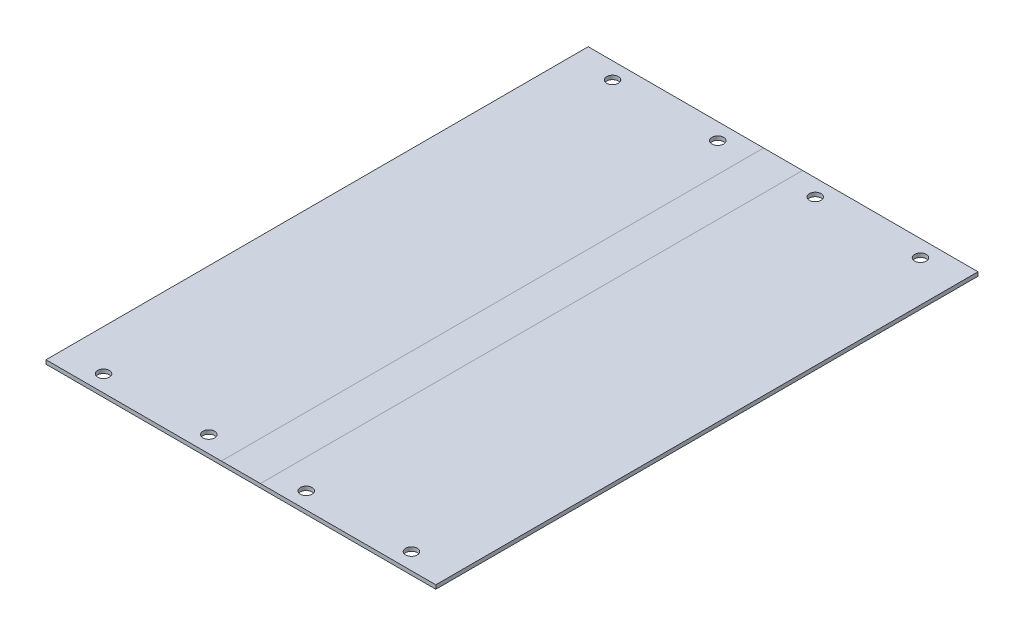
ISO-10303-21;
HEADER;
FILE_DESCRIPTION(('STEP AP214'),'2;1');
FILE_NAME('part.step','',(''),(''),'','','');
FILE_SCHEMA(('AUTOMOTIVE_DESIGN { 1 0 10303 214 1 1 1 1 }'));
ENDSEC;
DATA;
#1=APPLICATION_CONTEXT('core data for automotive mechanical design processes');
#2=APPLICATION_PROTOCOL_DEFINITION('international standard','automotive_design',2000,#1);
#3=PRODUCT_CONTEXT('',#1,'mechanical');
#4=PRODUCT('Part','Part','',(#3));
#5=PRODUCT_RELATED_PRODUCT_CATEGORY('part','',(#4));
#6=PRODUCT_DEFINITION_FORMATION('','',#4);
#7=PRODUCT_DEFINITION_CONTEXT('part definition',#1,'design');
#8=PRODUCT_DEFINITION('design','',#6,#7);
#9=PRODUCT_DEFINITION_SHAPE('','',#8);
#10=(LENGTH_UNIT() NAMED_UNIT(*) SI_UNIT(.MILLI.,.METRE.));
#11=(NAMED_UNIT(*) PLANE_ANGLE_UNIT() SI_UNIT($,.RADIAN.));
#12=(NAMED_UNIT(*) SI_UNIT($,.STERADIAN.) SOLID_ANGLE_UNIT());
#13=UNCERTAINTY_MEASURE_WITH_UNIT(LENGTH_MEASURE(1.E-05),#10,'distance_accuracy_value','');
#14=(GEOMETRIC_REPRESENTATION_CONTEXT(3) GLOBAL_UNCERTAINTY_ASSIGNED_CONTEXT((#13)) GLOBAL_UNIT_ASSIGNED_CONTEXT((#10,
#11,#12)) REPRESENTATION_CONTEXT('',''));
#15=CARTESIAN_POINT('',(0.,0.,0.));
#16=DIRECTION('',(0.,0.,1.));
#17=DIRECTION('',(1.,0.,0.));
#18=AXIS2_PLACEMENT_3D('',#15,#16,#17);
#19=CARTESIAN_POINT('',(0.,1.,0.));
#20=DIRECTION('',(0.,1.,0.));
#21=DIRECTION('',(0.,0.,1.));
#22=AXIS2_PLACEMENT_3D('',#19,#20,#21);
#23=PLANE('',#22);
#24=DIRECTION('',(1.,0.,0.));
#25=VECTOR('',#24,1.);
#26=CARTESIAN_POINT('',(-50.,1.,69.55));
#27=LINE('',#26,#25);
#28=CARTESIAN_POINT('',(-4.99999999999999,1.,69.55));
#29=VERTEX_POINT('',#28);
#30=CARTESIAN_POINT('',(5.00000000000001,1.,69.55));
#31=VERTEX_POINT('',#30);
#32=EDGE_CURVE('E129',#29,#31,#27,.T.);
#33=ORIENTED_EDGE('',*,*,#32,.T.);
#34=DIRECTION('',(0.,0.,-1.));
#35=VECTOR('',#34,1.);
#36=CARTESIAN_POINT('',(5.00000000000001,1.,0.));
#37=LINE('',#36,#35);
#38=CARTESIAN_POINT('',(5.00000000000001,1.,-69.55));
#39=VERTEX_POINT('',#38);
#40=EDGE_CURVE('E11',#31,#39,#37,.T.);
#41=ORIENTED_EDGE('',*,*,#40,.T.);
#42=DIRECTION('',(-1.,0.,0.));
#43=VECTOR('',#42,1.);
#44=CARTESIAN_POINT('',(-50.,1.,-69.55));
#45=LINE('',#44,#43);
#46=CARTESIAN_POINT('',(-4.99999999999999,1.,-69.55));
#47=VERTEX_POINT('',#46);
#48=EDGE_CURVE('E91',#39,#47,#45,.T.);
#49=ORIENTED_EDGE('',*,*,#48,.T.);
#50=DIRECTION('',(0.,0.,-1.));
#51=VECTOR('',#50,1.);
#52=CARTESIAN_POINT('',(-4.99999999999999,1.,0.));
#53=LINE('',#52,#51);
#54=EDGE_CURVE('E43',#29,#47,#53,.T.);
#55=ORIENTED_EDGE('',*,*,#54,.F.);
#56=EDGE_LOOP('',(#33,#41,#49,#55));
#57=FACE_BOUND('',#56,.T.);
#58=ADVANCED_FACE('F34',(#57),#23,.T.);
#59=CARTESIAN_POINT('',(-12.5,1.,-65.29));
#60=DIRECTION('',(0.,1.,0.));
#61=DIRECTION('',(0.,0.,1.));
#62=AXIS2_PLACEMENT_3D('',#59,#60,#61);
#63=CIRCLE('',#62,1.5);
#64=CARTESIAN_POINT('',(-12.5,1.,-63.79));
#65=VERTEX_POINT('',#64);
#66=EDGE_CURVE('E131',#65,#65,#63,.T.);
#67=ORIENTED_EDGE('',*,*,#66,.F.);
#68=EDGE_LOOP('',(#67));
#69=FACE_BOUND('',#68,.T.);
#70=CARTESIAN_POINT('',(-39.5,1.,-65.29));
#71=DIRECTION('',(0.,1.,0.));
#72=DIRECTION('',(0.,0.,1.));
#73=AXIS2_PLACEMENT_3D('',#70,#71,#72);
#74=CIRCLE('',#73,1.5);
#75=CARTESIAN_POINT('',(-39.5,1.,-63.79));
#76=VERTEX_POINT('',#75);
#77=EDGE_CURVE('E137',#76,#76,#74,.T.);
#78=ORIENTED_EDGE('',*,*,#77,.F.);
#79=EDGE_LOOP('',(#78));
#80=FACE_BOUND('',#79,.T.);
#81=CARTESIAN_POINT('',(-12.5,1.,65.29));
#82=DIRECTION('',(0.,1.,0.));
#83=DIRECTION('',(0.,0.,-1.));
#84=AXIS2_PLACEMENT_3D('',#81,#82,#83);
#85=CIRCLE('',#84,1.5);
#86=CARTESIAN_POINT('',(-12.5,1.,63.79));
#87=VERTEX_POINT('',#86);
#88=EDGE_CURVE('E167',#87,#87,#85,.T.);
#89=ORIENTED_EDGE('',*,*,#88,.F.);
#90=EDGE_LOOP('',(#89));
#91=FACE_BOUND('',#90,.T.);
#92=CARTESIAN_POINT('',(-39.5,1.,65.29));
#93=DIRECTION('',(0.,1.,0.));
#94=DIRECTION('',(0.,0.,-1.));
#95=AXIS2_PLACEMENT_3D('',#92,#93,#94);
#96=CIRCLE('',#95,1.5);
#97=CARTESIAN_POINT('',(-39.5,1.,63.79));
#98=VERTEX_POINT('',#97);
#99=EDGE_CURVE('E173',#98,#98,#96,.T.);
#100=ORIENTED_EDGE('',*,*,#99,.F.);
#101=EDGE_LOOP('',(#100));
#102=FACE_BOUND('',#101,.T.);
#103=CARTESIAN_POINT('',(-50.,1.,69.55));
#104=VERTEX_POINT('',#103);
#105=EDGE_CURVE('E119',#104,#29,#27,.T.);
#106=ORIENTED_EDGE('',*,*,#105,.T.);
#107=ORIENTED_EDGE('',*,*,#54,.T.);
#108=CARTESIAN_POINT('',(-50.,1.,-69.55));
#109=VERTEX_POINT('',#108);
#110=EDGE_CURVE('E94',#47,#109,#45,.T.);
#111=ORIENTED_EDGE('',*,*,#110,.T.);
#112=DIRECTION('',(0.,0.,1.));
#113=VECTOR('',#112,1.);
#114=CARTESIAN_POINT('',(-50.,1.,-69.55));
#115=LINE('',#114,#113);
#116=EDGE_CURVE('E92',#109,#104,#115,.T.);
#117=ORIENTED_EDGE('',*,*,#116,.T.);
#118=EDGE_LOOP('',(#106,#107,#111,#117));
#119=FACE_BOUND('',#118,.T.);
#120=ADVANCED_FACE('F189',(#69,#80,#91,#102,#119),#23,.T.);
#121=CARTESIAN_POINT('',(50.,1.,-69.55));
#122=DIRECTION('',(-1.,0.,0.));
#123=DIRECTION('',(0.,0.,1.));
#124=AXIS2_PLACEMENT_3D('',#121,#122,#123);
#125=PLANE('',#124);
#126=DIRECTION('',(0.,0.,-1.));
#127=VECTOR('',#126,1.);
#128=CARTESIAN_POINT('',(50.,0.,-69.55));
#129=LINE('',#128,#127);
#130=CARTESIAN_POINT('',(50.,0.,69.55));
#131=VERTEX_POINT('',#130);
#132=CARTESIAN_POINT('',(50.,0.,-69.55));
#133=VERTEX_POINT('',#132);
#134=EDGE_CURVE('E106',#131,#133,#129,.T.);
#135=ORIENTED_EDGE('',*,*,#134,.T.);
#136=DIRECTION('',(0.,-1.,0.));
#137=VECTOR('',#136,1.);
#138=CARTESIAN_POINT('',(50.,1.,-69.55));
#139=LINE('',#138,#137);
#140=CARTESIAN_POINT('',(50.,1.,-69.55));
#141=VERTEX_POINT('',#140);
#142=EDGE_CURVE('E88',#141,#133,#139,.T.);
#143=ORIENTED_EDGE('',*,*,#142,.F.);
#144=DIRECTION('',(0.,0.,-1.));
#145=VECTOR('',#144,1.);
#146=CARTESIAN_POINT('',(50.,1.,-69.55));
#147=LINE('',#146,#145);
#148=CARTESIAN_POINT('',(50.,1.,69.55));
#149=VERTEX_POINT('',#148);
#150=EDGE_CURVE('E96',#149,#141,#147,.T.);
#151=ORIENTED_EDGE('',*,*,#150,.F.);
#152=DIRECTION('',(0.,-1.,0.));
#153=VECTOR('',#152,1.);
#154=CARTESIAN_POINT('',(50.,1.,69.55));
#155=LINE('',#154,#153);
#156=EDGE_CURVE('E117',#149,#131,#155,.T.);
#157=ORIENTED_EDGE('',*,*,#156,.T.);
#158=EDGE_LOOP('',(#135,#143,#151,#157));
#159=FACE_BOUND('',#158,.T.);
#160=ADVANCED_FACE('F36',(#159),#125,.F.);
#161=CARTESIAN_POINT('',(-50.,1.,-69.55));
#162=DIRECTION('',(0.,0.,1.));
#163=DIRECTION('',(1.,0.,0.));
#164=AXIS2_PLACEMENT_3D('',#161,#162,#163);
#165=PLANE('',#164);
#166=DIRECTION('',(-1.,0.,0.));
#167=VECTOR('',#166,1.);
#168=CARTESIAN_POINT('',(-50.,0.,-69.55));
#169=LINE('',#168,#167);
#170=CARTESIAN_POINT('',(-50.,0.,-69.55));
#171=VERTEX_POINT('',#170);
#172=EDGE_CURVE('E123',#133,#171,#169,.T.);
#173=ORIENTED_EDGE('',*,*,#172,.T.);
#174=DIRECTION('',(0.,-1.,0.));
#175=VECTOR('',#174,1.);
#176=CARTESIAN_POINT('',(-50.,1.,-69.55));
#177=LINE('',#176,#175);
#178=EDGE_CURVE('E107',#109,#171,#177,.T.);
#179=ORIENTED_EDGE('',*,*,#178,.F.);
#180=ORIENTED_EDGE('',*,*,#110,.F.);
#181=ORIENTED_EDGE('',*,*,#48,.F.);
#182=EDGE_CURVE('E84',#141,#39,#45,.T.);
#183=ORIENTED_EDGE('',*,*,#182,.F.);
#184=ORIENTED_EDGE('',*,*,#142,.T.);
#185=EDGE_LOOP('',(#173,#179,#180,#181,#183,#184));
#186=FACE_BOUND('',#185,.T.);
#187=ADVANCED_FACE('F86',(#186),#165,.F.);
#188=CARTESIAN_POINT('',(-50.,1.,-69.55));
#189=DIRECTION('',(1.,0.,0.));
#190=DIRECTION('',(0.,0.,-1.));
#191=AXIS2_PLACEMENT_3D('',#188,#189,#190);
#192=PLANE('',#191);
#193=DIRECTION('',(0.,0.,1.));
#194=VECTOR('',#193,1.);
#195=CARTESIAN_POINT('',(-50.,0.,-69.55));
#196=LINE('',#195,#194);
#197=CARTESIAN_POINT('',(-50.,0.,69.55));
#198=VERTEX_POINT('',#197);
#199=EDGE_CURVE('E121',#171,#198,#196,.T.);
#200=ORIENTED_EDGE('',*,*,#199,.T.);
#201=DIRECTION('',(0.,-1.,0.));
#202=VECTOR('',#201,1.);
#203=CARTESIAN_POINT('',(-50.,1.,69.55));
#204=LINE('',#203,#202);
#205=EDGE_CURVE('E112',#104,#198,#204,.T.);
#206=ORIENTED_EDGE('',*,*,#205,.F.);
#207=ORIENTED_EDGE('',*,*,#116,.F.);
#208=ORIENTED_EDGE('',*,*,#178,.T.);
#209=EDGE_LOOP('',(#200,#206,#207,#208));
#210=FACE_BOUND('',#209,.T.);
#211=ADVANCED_FACE('F204',(#210),#192,.F.);
#212=CARTESIAN_POINT('',(-50.,1.,69.55));
#213=DIRECTION('',(0.,0.,-1.));
#214=DIRECTION('',(-1.,0.,0.));
#215=AXIS2_PLACEMENT_3D('',#212,#213,#214);
#216=PLANE('',#215);
#217=DIRECTION('',(1.,0.,0.));
#218=VECTOR('',#217,1.);
#219=CARTESIAN_POINT('',(-50.,0.,69.55));
#220=LINE('',#219,#218);
#221=EDGE_CURVE('E103',#198,#131,#220,.T.);
#222=ORIENTED_EDGE('',*,*,#221,.T.);
#223=ORIENTED_EDGE('',*,*,#156,.F.);
#224=EDGE_CURVE('E99',#31,#149,#27,.T.);
#225=ORIENTED_EDGE('',*,*,#224,.F.);
#226=ORIENTED_EDGE('',*,*,#32,.F.);
#227=ORIENTED_EDGE('',*,*,#105,.F.);
#228=ORIENTED_EDGE('',*,*,#205,.T.);
#229=EDGE_LOOP('',(#222,#223,#225,#226,#227,#228));
#230=FACE_BOUND('',#229,.T.);
#231=ADVANCED_FACE('F199',(#230),#216,.F.);
#232=ORIENTED_EDGE('',*,*,#40,.F.);
#233=ORIENTED_EDGE('',*,*,#224,.T.);
#234=ORIENTED_EDGE('',*,*,#150,.T.);
#235=ORIENTED_EDGE('',*,*,#182,.T.);
#236=EDGE_LOOP('',(#232,#233,#234,#235));
#237=FACE_BOUND('',#236,.T.);
#238=CARTESIAN_POINT('',(12.5,1.,65.29));
#239=DIRECTION('',(0.,1.,0.));
#240=DIRECTION('',(0.,0.,1.));
#241=AXIS2_PLACEMENT_3D('',#238,#239,#240);
#242=CIRCLE('',#241,1.5);
#243=CARTESIAN_POINT('',(12.5,1.,66.79));
#244=VERTEX_POINT('',#243);
#245=EDGE_CURVE('E161',#244,#244,#242,.T.);
#246=ORIENTED_EDGE('',*,*,#245,.F.);
#247=EDGE_LOOP('',(#246));
#248=FACE_BOUND('',#247,.T.);
#249=CARTESIAN_POINT('',(39.4999999999999,1.,65.29));
#250=DIRECTION('',(0.,1.,0.));
#251=DIRECTION('',(0.,0.,1.));
#252=AXIS2_PLACEMENT_3D('',#249,#250,#251);
#253=CIRCLE('',#252,1.5);
#254=CARTESIAN_POINT('',(39.4999999999999,1.,66.79));
#255=VERTEX_POINT('',#254);
#256=EDGE_CURVE('E155',#255,#255,#253,.T.);
#257=ORIENTED_EDGE('',*,*,#256,.F.);
#258=EDGE_LOOP('',(#257));
#259=FACE_BOUND('',#258,.T.);
#260=CARTESIAN_POINT('',(12.5,1.,-65.29));
#261=DIRECTION('',(0.,1.,0.));
#262=DIRECTION('',(0.,0.,-1.));
#263=AXIS2_PLACEMENT_3D('',#260,#261,#262);
#264=CIRCLE('',#263,1.5);
#265=CARTESIAN_POINT('',(12.5,1.,-66.79));
#266=VERTEX_POINT('',#265);
#267=EDGE_CURVE('E149',#266,#266,#264,.T.);
#268=ORIENTED_EDGE('',*,*,#267,.F.);
#269=EDGE_LOOP('',(#268));
#270=FACE_BOUND('',#269,.T.);
#271=CARTESIAN_POINT('',(39.5,1.,-65.29));
#272=DIRECTION('',(0.,1.,0.));
#273=DIRECTION('',(0.,0.,-1.));
#274=AXIS2_PLACEMENT_3D('',#271,#272,#273);
#275=CIRCLE('',#274,1.5);
#276=CARTESIAN_POINT('',(39.5,1.,-66.79));
#277=VERTEX_POINT('',#276);
#278=EDGE_CURVE('E143',#277,#277,#275,.T.);
#279=ORIENTED_EDGE('',*,*,#278,.F.);
#280=EDGE_LOOP('',(#279));
#281=FACE_BOUND('',#280,.T.);
#282=ADVANCED_FACE('F97',(#237,#248,#259,#270,#281),#23,.T.);
#283=CARTESIAN_POINT('',(0.,0.,0.));
#284=DIRECTION('',(0.,1.,0.));
#285=DIRECTION('',(0.,0.,1.));
#286=AXIS2_PLACEMENT_3D('',#283,#284,#285);
#287=PLANE('',#286);
#288=CARTESIAN_POINT('',(-39.5,0.,65.29));
#289=DIRECTION('',(0.,1.,0.));
#290=DIRECTION('',(0.,0.,-1.));
#291=AXIS2_PLACEMENT_3D('',#288,#289,#290);
#292=CIRCLE('',#291,1.5);
#293=CARTESIAN_POINT('',(-39.5,0.,63.79));
#294=VERTEX_POINT('',#293);
#295=EDGE_CURVE('E170',#294,#294,#292,.T.);
#296=ORIENTED_EDGE('',*,*,#295,.T.);
#297=EDGE_LOOP('',(#296));
#298=FACE_BOUND('',#297,.T.);
#299=CARTESIAN_POINT('',(-12.5,0.,65.29));
#300=DIRECTION('',(0.,1.,0.));
#301=DIRECTION('',(0.,0.,-1.));
#302=AXIS2_PLACEMENT_3D('',#299,#300,#301);
#303=CIRCLE('',#302,1.5);
#304=CARTESIAN_POINT('',(-12.5,0.,63.79));
#305=VERTEX_POINT('',#304);
#306=EDGE_CURVE('E164',#305,#305,#303,.T.);
#307=ORIENTED_EDGE('',*,*,#306,.T.);
#308=EDGE_LOOP('',(#307));
#309=FACE_BOUND('',#308,.T.);
#310=CARTESIAN_POINT('',(12.5,0.,65.29));
#311=DIRECTION('',(0.,1.,0.));
#312=DIRECTION('',(0.,0.,1.));
#313=AXIS2_PLACEMENT_3D('',#310,#311,#312);
#314=CIRCLE('',#313,1.5);
#315=CARTESIAN_POINT('',(12.5,0.,66.79));
#316=VERTEX_POINT('',#315);
#317=EDGE_CURVE('E158',#316,#316,#314,.T.);
#318=ORIENTED_EDGE('',*,*,#317,.T.);
#319=EDGE_LOOP('',(#318));
#320=FACE_BOUND('',#319,.T.);
#321=CARTESIAN_POINT('',(39.4999999999999,0.,65.29));
#322=DIRECTION('',(0.,1.,0.));
#323=DIRECTION('',(0.,0.,1.));
#324=AXIS2_PLACEMENT_3D('',#321,#322,#323);
#325=CIRCLE('',#324,1.5);
#326=CARTESIAN_POINT('',(39.4999999999999,0.,66.79));
#327=VERTEX_POINT('',#326);
#328=EDGE_CURVE('E152',#327,#327,#325,.T.);
#329=ORIENTED_EDGE('',*,*,#328,.T.);
#330=EDGE_LOOP('',(#329));
#331=FACE_BOUND('',#330,.T.);
#332=CARTESIAN_POINT('',(12.5,0.,-65.29));
#333=DIRECTION('',(0.,1.,0.));
#334=DIRECTION('',(0.,0.,-1.));
#335=AXIS2_PLACEMENT_3D('',#332,#333,#334);
#336=CIRCLE('',#335,1.5);
#337=CARTESIAN_POINT('',(12.5,0.,-66.79));
#338=VERTEX_POINT('',#337);
#339=EDGE_CURVE('E146',#338,#338,#336,.T.);
#340=ORIENTED_EDGE('',*,*,#339,.T.);
#341=EDGE_LOOP('',(#340));
#342=FACE_BOUND('',#341,.T.);
#343=CARTESIAN_POINT('',(39.5,0.,-65.29));
#344=DIRECTION('',(0.,1.,0.));
#345=DIRECTION('',(0.,0.,-1.));
#346=AXIS2_PLACEMENT_3D('',#343,#344,#345);
#347=CIRCLE('',#346,1.5);
#348=CARTESIAN_POINT('',(39.5,0.,-66.79));
#349=VERTEX_POINT('',#348);
#350=EDGE_CURVE('E140',#349,#349,#347,.T.);
#351=ORIENTED_EDGE('',*,*,#350,.T.);
#352=EDGE_LOOP('',(#351));
#353=FACE_BOUND('',#352,.T.);
#354=CARTESIAN_POINT('',(-39.5,0.,-65.29));
#355=DIRECTION('',(0.,1.,0.));
#356=DIRECTION('',(0.,0.,1.));
#357=AXIS2_PLACEMENT_3D('',#354,#355,#356);
#358=CIRCLE('',#357,1.5);
#359=CARTESIAN_POINT('',(-39.5,0.,-63.79));
#360=VERTEX_POINT('',#359);
#361=EDGE_CURVE('E134',#360,#360,#358,.T.);
#362=ORIENTED_EDGE('',*,*,#361,.T.);
#363=EDGE_LOOP('',(#362));
#364=FACE_BOUND('',#363,.T.);
#365=CARTESIAN_POINT('',(-12.5,0.,-65.29));
#366=DIRECTION('',(0.,1.,0.));
#367=DIRECTION('',(0.,0.,1.));
#368=AXIS2_PLACEMENT_3D('',#365,#366,#367);
#369=CIRCLE('',#368,1.5);
#370=CARTESIAN_POINT('',(-12.5,0.,-63.79));
#371=VERTEX_POINT('',#370);
#372=EDGE_CURVE('E126',#371,#371,#369,.T.);
#373=ORIENTED_EDGE('',*,*,#372,.T.);
#374=EDGE_LOOP('',(#373));
#375=FACE_BOUND('',#374,.T.);
#376=ORIENTED_EDGE('',*,*,#134,.F.);
#377=ORIENTED_EDGE('',*,*,#221,.F.);
#378=ORIENTED_EDGE('',*,*,#199,.F.);
#379=ORIENTED_EDGE('',*,*,#172,.F.);
#380=EDGE_LOOP('',(#376,#377,#378,#379));
#381=FACE_BOUND('',#380,.T.);
#382=ADVANCED_FACE('F179',(#298,#309,#320,#331,#342,#353,#364,#375,#381),#287,.F.);
#383=CARTESIAN_POINT('',(-12.5,0.,-65.29));
#384=DIRECTION('',(0.,1.,0.));
#385=DIRECTION('',(0.,0.,1.));
#386=AXIS2_PLACEMENT_3D('',#383,#384,#385);
#387=CYLINDRICAL_SURFACE('',#386,1.5);
#388=ORIENTED_EDGE('',*,*,#372,.F.);
#389=EDGE_LOOP('',(#388));
#390=FACE_BOUND('',#389,.T.);
#391=ORIENTED_EDGE('',*,*,#66,.T.);
#392=EDGE_LOOP('',(#391));
#393=FACE_BOUND('',#392,.T.);
#394=ADVANCED_FACE('F207',(#390,#393),#387,.F.);
#395=CARTESIAN_POINT('',(-39.5,0.,-65.29));
#396=DIRECTION('',(0.,1.,0.));
#397=DIRECTION('',(0.,0.,1.));
#398=AXIS2_PLACEMENT_3D('',#395,#396,#397);
#399=CYLINDRICAL_SURFACE('',#398,1.5);
#400=ORIENTED_EDGE('',*,*,#361,.F.);
#401=EDGE_LOOP('',(#400));
#402=FACE_BOUND('',#401,.T.);
#403=ORIENTED_EDGE('',*,*,#77,.T.);
#404=EDGE_LOOP('',(#403));
#405=FACE_BOUND('',#404,.T.);
#406=ADVANCED_FACE('F213',(#402,#405),#399,.F.);
#407=CARTESIAN_POINT('',(39.5,0.,-65.29));
#408=DIRECTION('',(0.,1.,0.));
#409=DIRECTION('',(0.,0.,1.));
#410=AXIS2_PLACEMENT_3D('',#407,#408,#409);
#411=CYLINDRICAL_SURFACE('',#410,1.5);
#412=ORIENTED_EDGE('',*,*,#350,.F.);
#413=EDGE_LOOP('',(#412));
#414=FACE_BOUND('',#413,.T.);
#415=ORIENTED_EDGE('',*,*,#278,.T.);
#416=EDGE_LOOP('',(#415));
#417=FACE_BOUND('',#416,.T.);
#418=ADVANCED_FACE('F223',(#414,#417),#411,.F.);
#419=CARTESIAN_POINT('',(12.5,0.,-65.29));
#420=DIRECTION('',(0.,1.,0.));
#421=DIRECTION('',(0.,0.,1.));
#422=AXIS2_PLACEMENT_3D('',#419,#420,#421);
#423=CYLINDRICAL_SURFACE('',#422,1.5);
#424=ORIENTED_EDGE('',*,*,#339,.F.);
#425=EDGE_LOOP('',(#424));
#426=FACE_BOUND('',#425,.T.);
#427=ORIENTED_EDGE('',*,*,#267,.T.);
#428=EDGE_LOOP('',(#427));
#429=FACE_BOUND('',#428,.T.);
#430=ADVANCED_FACE('F227',(#426,#429),#423,.F.);
#431=CARTESIAN_POINT('',(39.4999999999999,0.,65.29));
#432=DIRECTION('',(0.,1.,0.));
#433=DIRECTION('',(0.,0.,1.));
#434=AXIS2_PLACEMENT_3D('',#431,#432,#433);
#435=CYLINDRICAL_SURFACE('',#434,1.5);
#436=ORIENTED_EDGE('',*,*,#328,.F.);
#437=EDGE_LOOP('',(#436));
#438=FACE_BOUND('',#437,.T.);
#439=ORIENTED_EDGE('',*,*,#256,.T.);
#440=EDGE_LOOP('',(#439));
#441=FACE_BOUND('',#440,.T.);
#442=ADVANCED_FACE('F231',(#438,#441),#435,.F.);
#443=CARTESIAN_POINT('',(12.5,0.,65.29));
#444=DIRECTION('',(0.,1.,0.));
#445=DIRECTION('',(0.,0.,1.));
#446=AXIS2_PLACEMENT_3D('',#443,#444,#445);
#447=CYLINDRICAL_SURFACE('',#446,1.5);
#448=ORIENTED_EDGE('',*,*,#317,.F.);
#449=EDGE_LOOP('',(#448));
#450=FACE_BOUND('',#449,.T.);
#451=ORIENTED_EDGE('',*,*,#245,.T.);
#452=EDGE_LOOP('',(#451));
#453=FACE_BOUND('',#452,.T.);
#454=ADVANCED_FACE('F235',(#450,#453),#447,.F.);
#455=CARTESIAN_POINT('',(-12.5,0.,65.29));
#456=DIRECTION('',(0.,1.,0.));
#457=DIRECTION('',(0.,0.,1.));
#458=AXIS2_PLACEMENT_3D('',#455,#456,#457);
#459=CYLINDRICAL_SURFACE('',#458,1.5);
#460=ORIENTED_EDGE('',*,*,#306,.F.);
#461=EDGE_LOOP('',(#460));
#462=FACE_BOUND('',#461,.T.);
#463=ORIENTED_EDGE('',*,*,#88,.T.);
#464=EDGE_LOOP('',(#463));
#465=FACE_BOUND('',#464,.T.);
#466=ADVANCED_FACE('F185',(#462,#465),#459,.F.);
#467=CARTESIAN_POINT('',(-39.5,0.,65.29));
#468=DIRECTION('',(0.,1.,0.));
#469=DIRECTION('',(0.,0.,1.));
#470=AXIS2_PLACEMENT_3D('',#467,#468,#469);
#471=CYLINDRICAL_SURFACE('',#470,1.5);
#472=ORIENTED_EDGE('',*,*,#295,.F.);
#473=EDGE_LOOP('',(#472));
#474=FACE_BOUND('',#473,.T.);
#475=ORIENTED_EDGE('',*,*,#99,.T.);
#476=EDGE_LOOP('',(#475));
#477=FACE_BOUND('',#476,.T.);
#478=ADVANCED_FACE('F182',(#474,#477),#471,.F.);
#479=CLOSED_SHELL('',(#58,#120,#160,#187,#211,#231,#282,#382,#394,#406,#418,#430,#442,#454,#466,#478));
#480=MANIFOLD_SOLID_BREP('B2',#479);
#481=ADVANCED_BREP_SHAPE_REPRESENTATION('',(#18,#480),#14);
#482=SHAPE_DEFINITION_REPRESENTATION(#9,#481);
ENDSEC;
END-ISO-10303-21;
